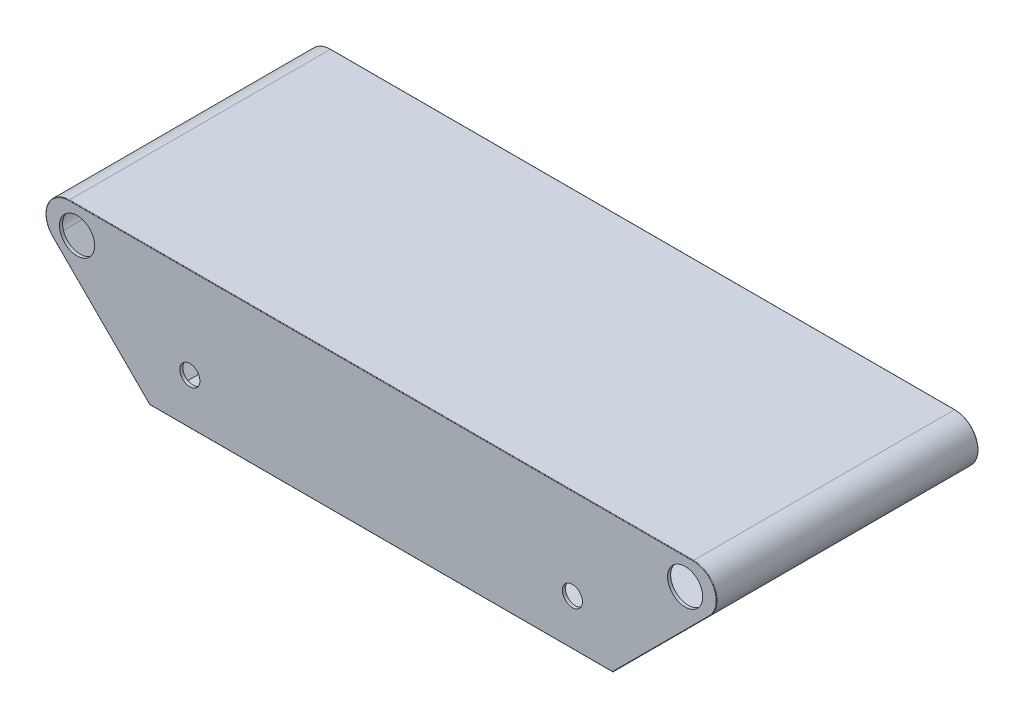
ISO-10303-21;
HEADER;
FILE_DESCRIPTION(('STEP AP214'),'2;1');
FILE_NAME('part.step','',(''),(''),'','','');
FILE_SCHEMA(('AUTOMOTIVE_DESIGN { 1 0 10303 214 1 1 1 1 }'));
ENDSEC;
DATA;
#1=APPLICATION_CONTEXT('core data for automotive mechanical design processes');
#2=APPLICATION_PROTOCOL_DEFINITION('international standard','automotive_design',2000,#1);
#3=PRODUCT_CONTEXT('',#1,'mechanical');
#4=PRODUCT('Part','Part','',(#3));
#5=PRODUCT_RELATED_PRODUCT_CATEGORY('part','',(#4));
#6=PRODUCT_DEFINITION_FORMATION('','',#4);
#7=PRODUCT_DEFINITION_CONTEXT('part definition',#1,'design');
#8=PRODUCT_DEFINITION('design','',#6,#7);
#9=PRODUCT_DEFINITION_SHAPE('','',#8);
#10=(LENGTH_UNIT() NAMED_UNIT(*) SI_UNIT(.MILLI.,.METRE.));
#11=(NAMED_UNIT(*) PLANE_ANGLE_UNIT() SI_UNIT($,.RADIAN.));
#12=(NAMED_UNIT(*) SI_UNIT($,.STERADIAN.) SOLID_ANGLE_UNIT());
#13=UNCERTAINTY_MEASURE_WITH_UNIT(LENGTH_MEASURE(1.E-05),#10,'distance_accuracy_value','');
#14=(GEOMETRIC_REPRESENTATION_CONTEXT(3) GLOBAL_UNCERTAINTY_ASSIGNED_CONTEXT((#13)) GLOBAL_UNIT_ASSIGNED_CONTEXT((#10,
#11,#12)) REPRESENTATION_CONTEXT('',''));
#15=CARTESIAN_POINT('',(0.,0.,0.));
#16=DIRECTION('',(0.,0.,1.));
#17=DIRECTION('',(1.,0.,0.));
#18=AXIS2_PLACEMENT_3D('',#15,#16,#17);
#19=CARTESIAN_POINT('',(-230.,3.04,-130.));
#20=DIRECTION('',(0.,0.,1.));
#21=DIRECTION('',(1.,0.,0.));
#22=AXIS2_PLACEMENT_3D('',#19,#20,#21);
#23=PLANE('',#22);
#24=CARTESIAN_POINT('',(-190.,45.5,-130.));
#25=DIRECTION('',(0.,0.,1.));
#26=DIRECTION('',(1.,0.,0.));
#27=AXIS2_PLACEMENT_3D('',#24,#25,#26);
#28=CIRCLE('',#27,10.);
#29=CARTESIAN_POINT('',(-180.,45.5,-130.));
#30=VERTEX_POINT('',#29);
#31=EDGE_CURVE('E402',#30,#30,#28,.T.);
#32=ORIENTED_EDGE('',*,*,#31,.T.);
#33=EDGE_LOOP('',(#32));
#34=FACE_BOUND('',#33,.T.);
#35=CARTESIAN_POINT('',(190.,45.5,-130.));
#36=DIRECTION('',(0.,0.,1.));
#37=DIRECTION('',(-1.,0.,0.));
#38=AXIS2_PLACEMENT_3D('',#35,#36,#37);
#39=CIRCLE('',#38,10.);
#40=CARTESIAN_POINT('',(180.,45.5,-130.));
#41=VERTEX_POINT('',#40);
#42=EDGE_CURVE('E418',#41,#41,#39,.T.);
#43=ORIENTED_EDGE('',*,*,#42,.T.);
#44=EDGE_LOOP('',(#43));
#45=FACE_BOUND('',#44,.T.);
#46=DIRECTION('',(-1.,0.,0.));
#47=VECTOR('',#46,1.);
#48=CARTESIAN_POINT('',(-230.,0.5,-130.));
#49=LINE('',#48,#47);
#50=CARTESIAN_POINT('',(229.792893218813,0.499999999999996,-130.));
#51=VERTEX_POINT('',#50);
#52=CARTESIAN_POINT('',(-229.792893218813,0.5,-130.));
#53=VERTEX_POINT('',#52);
#54=EDGE_CURVE('E319',#51,#53,#49,.T.);
#55=ORIENTED_EDGE('',*,*,#54,.T.);
#56=DIRECTION('',(0.707106781186544,-0.707106781186551,0.));
#57=VECTOR('',#56,1.);
#58=CARTESIAN_POINT('',(-326.04846686296,96.7555736441475,-130.));
#59=LINE('',#58,#57);
#60=CARTESIAN_POINT('',(-326.04846686296,96.7555736441475,-130.));
#61=VERTEX_POINT('',#60);
#62=EDGE_CURVE('E327',#53,#61,#59,.F.);
#63=ORIENTED_EDGE('',*,*,#62,.T.);
#64=CARTESIAN_POINT('',(-310.,112.804040507107,-130.));
#65=DIRECTION('',(0.,0.,1.));
#66=DIRECTION('',(1.,0.,0.));
#67=AXIS2_PLACEMENT_3D('',#64,#65,#66);
#68=CIRCLE('',#67,22.6959594928929);
#69=CARTESIAN_POINT('',(-310.,135.5,-130.));
#70=VERTEX_POINT('',#69);
#71=EDGE_CURVE('E325',#61,#70,#68,.F.);
#72=ORIENTED_EDGE('',*,*,#71,.T.);
#73=DIRECTION('',(-1.,0.,0.));
#74=VECTOR('',#73,1.);
#75=CARTESIAN_POINT('',(310.,135.5,-130.));
#76=LINE('',#75,#74);
#77=CARTESIAN_POINT('',(310.,135.5,-130.));
#78=VERTEX_POINT('',#77);
#79=EDGE_CURVE('E323',#70,#78,#76,.F.);
#80=ORIENTED_EDGE('',*,*,#79,.T.);
#81=CARTESIAN_POINT('',(310.,112.804040507107,-130.));
#82=DIRECTION('',(0.,0.,1.));
#83=DIRECTION('',(1.,0.,0.));
#84=AXIS2_PLACEMENT_3D('',#81,#82,#83);
#85=CIRCLE('',#84,22.6959594928929);
#86=CARTESIAN_POINT('',(326.04846686296,96.7555736441474,-130.));
#87=VERTEX_POINT('',#86);
#88=EDGE_CURVE('E321',#78,#87,#85,.F.);
#89=ORIENTED_EDGE('',*,*,#88,.T.);
#90=DIRECTION('',(0.707106781186543,0.707106781186552,0.));
#91=VECTOR('',#90,1.);
#92=CARTESIAN_POINT('',(229.646446609407,0.353553390593277,-130.));
#93=LINE('',#92,#91);
#94=EDGE_CURVE('E317',#87,#51,#93,.F.);
#95=ORIENTED_EDGE('',*,*,#94,.T.);
#96=EDGE_LOOP('',(#55,#63,#72,#80,#89,#95));
#97=FACE_BOUND('',#96,.T.);
#98=CARTESIAN_POINT('',(-302.023340597113,109.5,-130.));
#99=DIRECTION('',(0.,0.,1.));
#100=DIRECTION('',(1.,0.,0.));
#101=AXIS2_PLACEMENT_3D('',#98,#99,#100);
#102=CIRCLE('',#101,17.465);
#103=CARTESIAN_POINT('',(-284.558340597113,109.5,-130.));
#104=VERTEX_POINT('',#103);
#105=EDGE_CURVE('E430',#104,#104,#102,.T.);
#106=ORIENTED_EDGE('',*,*,#105,.T.);
#107=EDGE_LOOP('',(#106));
#108=FACE_BOUND('',#107,.T.);
#109=CARTESIAN_POINT('',(302.023340597113,109.5,-130.));
#110=DIRECTION('',(0.,0.,-1.));
#111=DIRECTION('',(-1.,0.,0.));
#112=AXIS2_PLACEMENT_3D('',#109,#110,#111);
#113=CIRCLE('',#112,17.465);
#114=CARTESIAN_POINT('',(284.558340597113,109.5,-130.));
#115=VERTEX_POINT('',#114);
#116=EDGE_CURVE('E427',#115,#115,#113,.T.);
#117=ORIENTED_EDGE('',*,*,#116,.F.);
#118=EDGE_LOOP('',(#117));
#119=FACE_BOUND('',#118,.T.);
#120=ADVANCED_FACE('F75',(#34,#45,#97,#108,#119),#23,.F.);
#121=CARTESIAN_POINT('',(-230.,3.04,130.));
#122=DIRECTION('',(0.,0.,-1.));
#123=DIRECTION('',(-1.,0.,0.));
#124=AXIS2_PLACEMENT_3D('',#121,#122,#123);
#125=PLANE('',#124);
#126=CARTESIAN_POINT('',(-190.,45.5,130.));
#127=DIRECTION('',(0.,0.,1.));
#128=DIRECTION('',(1.,0.,0.));
#129=AXIS2_PLACEMENT_3D('',#126,#127,#128);
#130=CIRCLE('',#129,10.);
#131=CARTESIAN_POINT('',(-180.,45.5,130.));
#132=VERTEX_POINT('',#131);
#133=EDGE_CURVE('E408',#132,#132,#130,.T.);
#134=ORIENTED_EDGE('',*,*,#133,.F.);
#135=EDGE_LOOP('',(#134));
#136=FACE_BOUND('',#135,.T.);
#137=CARTESIAN_POINT('',(190.,45.5,130.));
#138=DIRECTION('',(0.,0.,1.));
#139=DIRECTION('',(-1.,0.,0.));
#140=AXIS2_PLACEMENT_3D('',#137,#138,#139);
#141=CIRCLE('',#140,10.);
#142=CARTESIAN_POINT('',(180.,45.5,130.));
#143=VERTEX_POINT('',#142);
#144=EDGE_CURVE('E413',#143,#143,#141,.T.);
#145=ORIENTED_EDGE('',*,*,#144,.F.);
#146=EDGE_LOOP('',(#145));
#147=FACE_BOUND('',#146,.T.);
#148=CARTESIAN_POINT('',(-310.,112.804040507107,130.));
#149=DIRECTION('',(0.,0.,-1.));
#150=DIRECTION('',(-1.,0.,0.));
#151=AXIS2_PLACEMENT_3D('',#148,#149,#150);
#152=CIRCLE('',#151,22.6959594928929);
#153=CARTESIAN_POINT('',(-310.,135.5,130.));
#154=VERTEX_POINT('',#153);
#155=CARTESIAN_POINT('',(-326.04846686296,96.7555736441475,130.));
#156=VERTEX_POINT('',#155);
#157=EDGE_CURVE('E293',#154,#156,#152,.F.);
#158=ORIENTED_EDGE('',*,*,#157,.T.);
#159=DIRECTION('',(0.707106781186544,-0.707106781186551,0.));
#160=VECTOR('',#159,1.);
#161=CARTESIAN_POINT('',(-229.646446609407,0.353553390593285,130.));
#162=LINE('',#161,#160);
#163=CARTESIAN_POINT('',(-229.792893218813,0.5,130.));
#164=VERTEX_POINT('',#163);
#165=EDGE_CURVE('E295',#156,#164,#162,.T.);
#166=ORIENTED_EDGE('',*,*,#165,.T.);
#167=DIRECTION('',(1.,0.,0.));
#168=VECTOR('',#167,1.);
#169=CARTESIAN_POINT('',(230.,0.5,130.));
#170=LINE('',#169,#168);
#171=CARTESIAN_POINT('',(229.792893218813,0.5,130.));
#172=VERTEX_POINT('',#171);
#173=EDGE_CURVE('E285',#164,#172,#170,.T.);
#174=ORIENTED_EDGE('',*,*,#173,.T.);
#175=DIRECTION('',(0.707106781186543,0.707106781186552,0.));
#176=VECTOR('',#175,1.);
#177=CARTESIAN_POINT('',(326.04846686296,96.7555736441474,130.));
#178=LINE('',#177,#176);
#179=CARTESIAN_POINT('',(326.04846686296,96.7555736441474,130.));
#180=VERTEX_POINT('',#179);
#181=EDGE_CURVE('E287',#172,#180,#178,.T.);
#182=ORIENTED_EDGE('',*,*,#181,.T.);
#183=CARTESIAN_POINT('',(310.,112.804040507107,130.));
#184=DIRECTION('',(0.,0.,-1.));
#185=DIRECTION('',(-1.,0.,0.));
#186=AXIS2_PLACEMENT_3D('',#183,#184,#185);
#187=CIRCLE('',#186,22.6959594928929);
#188=CARTESIAN_POINT('',(310.,135.5,130.));
#189=VERTEX_POINT('',#188);
#190=EDGE_CURVE('E289',#180,#189,#187,.F.);
#191=ORIENTED_EDGE('',*,*,#190,.T.);
#192=DIRECTION('',(-1.,0.,0.));
#193=VECTOR('',#192,1.);
#194=CARTESIAN_POINT('',(-310.,135.5,130.));
#195=LINE('',#194,#193);
#196=EDGE_CURVE('E291',#189,#154,#195,.T.);
#197=ORIENTED_EDGE('',*,*,#196,.T.);
#198=EDGE_LOOP('',(#158,#166,#174,#182,#191,#197));
#199=FACE_BOUND('',#198,.T.);
#200=CARTESIAN_POINT('',(-302.023340597113,109.5,130.));
#201=DIRECTION('',(0.,0.,1.));
#202=DIRECTION('',(1.,0.,0.));
#203=AXIS2_PLACEMENT_3D('',#200,#201,#202);
#204=CIRCLE('',#203,17.465);
#205=CARTESIAN_POINT('',(-284.558340597113,109.5,130.));
#206=VERTEX_POINT('',#205);
#207=EDGE_CURVE('E424',#206,#206,#204,.T.);
#208=ORIENTED_EDGE('',*,*,#207,.F.);
#209=EDGE_LOOP('',(#208));
#210=FACE_BOUND('',#209,.T.);
#211=CARTESIAN_POINT('',(302.023340597113,109.5,130.));
#212=DIRECTION('',(0.,0.,-1.));
#213=DIRECTION('',(-1.,0.,0.));
#214=AXIS2_PLACEMENT_3D('',#211,#212,#213);
#215=CIRCLE('',#214,17.465);
#216=CARTESIAN_POINT('',(284.558340597113,109.5,130.));
#217=VERTEX_POINT('',#216);
#218=EDGE_CURVE('E396',#217,#217,#215,.T.);
#219=ORIENTED_EDGE('',*,*,#218,.T.);
#220=EDGE_LOOP('',(#219));
#221=FACE_BOUND('',#220,.T.);
#222=ADVANCED_FACE('F475',(#136,#147,#199,#210,#221),#125,.F.);
#223=CARTESIAN_POINT('',(0.,0.,0.));
#224=DIRECTION('',(0.,-1.,0.));
#225=DIRECTION('',(0.,0.,-1.));
#226=AXIS2_PLACEMENT_3D('',#223,#224,#225);
#227=PLANE('',#226);
#228=DIRECTION('',(0.,0.,-1.));
#229=VECTOR('',#228,1.);
#230=CARTESIAN_POINT('',(229.792893218813,0.,0.));
#231=LINE('',#230,#229);
#232=CARTESIAN_POINT('',(229.792893218813,0.,-129.5));
#233=VERTEX_POINT('',#232);
#234=CARTESIAN_POINT('',(229.792893218813,0.,129.5));
#235=VERTEX_POINT('',#234);
#236=EDGE_CURVE('E336',#233,#235,#231,.F.);
#237=ORIENTED_EDGE('',*,*,#236,.T.);
#238=DIRECTION('',(1.,0.,0.));
#239=VECTOR('',#238,1.);
#240=CARTESIAN_POINT('',(-230.,0.,129.5));
#241=LINE('',#240,#239);
#242=CARTESIAN_POINT('',(-229.792893218813,0.,129.5));
#243=VERTEX_POINT('',#242);
#244=EDGE_CURVE('E12',#235,#243,#241,.F.);
#245=ORIENTED_EDGE('',*,*,#244,.T.);
#246=DIRECTION('',(0.,0.,1.));
#247=VECTOR('',#246,1.);
#248=CARTESIAN_POINT('',(-229.792893218813,0.,0.));
#249=LINE('',#248,#247);
#250=CARTESIAN_POINT('',(-229.792893218813,0.,-129.5));
#251=VERTEX_POINT('',#250);
#252=EDGE_CURVE('E84',#243,#251,#249,.F.);
#253=ORIENTED_EDGE('',*,*,#252,.T.);
#254=DIRECTION('',(-1.,0.,0.));
#255=VECTOR('',#254,1.);
#256=CARTESIAN_POINT('',(230.,0.,-129.5));
#257=LINE('',#256,#255);
#258=EDGE_CURVE('E338',#251,#233,#257,.F.);
#259=ORIENTED_EDGE('',*,*,#258,.T.);
#260=EDGE_LOOP('',(#237,#245,#253,#259));
#261=FACE_BOUND('',#260,.T.);
#262=ADVANCED_FACE('F480',(#261),#227,.T.);
#263=CARTESIAN_POINT('',(-326.402020253553,96.4020202535542,126.96));
#264=DIRECTION('',(-0.707106781186551,-0.707106781186544,0.));
#265=DIRECTION('',(0.707106781186544,-0.707106781186551,0.));
#266=AXIS2_PLACEMENT_3D('',#263,#264,#265);
#267=PLANE('',#266);
#268=DIRECTION('',(0.,0.,1.));
#269=VECTOR('',#268,1.);
#270=CARTESIAN_POINT('',(-230.146446609407,0.146446609406728,126.96));
#271=LINE('',#270,#269);
#272=CARTESIAN_POINT('',(-230.146446609407,0.146446609406724,-129.5));
#273=VERTEX_POINT('',#272);
#274=CARTESIAN_POINT('',(-230.146446609407,0.146446609406724,129.5));
#275=VERTEX_POINT('',#274);
#276=EDGE_CURVE('E298',#273,#275,#271,.T.);
#277=ORIENTED_EDGE('',*,*,#276,.T.);
#278=DIRECTION('',(0.707106781186544,-0.707106781186551,0.));
#279=VECTOR('',#278,1.);
#280=CARTESIAN_POINT('',(-326.402020253553,96.4020202535542,129.5));
#281=LINE('',#280,#279);
#282=CARTESIAN_POINT('',(-326.402020253553,96.4020202535542,129.5));
#283=VERTEX_POINT('',#282);
#284=EDGE_CURVE('E302',#275,#283,#281,.F.);
#285=ORIENTED_EDGE('',*,*,#284,.T.);
#286=DIRECTION('',(0.,0.,1.));
#287=VECTOR('',#286,1.);
#288=CARTESIAN_POINT('',(-326.402020253553,96.4020202535542,126.96));
#289=LINE('',#288,#287);
#290=CARTESIAN_POINT('',(-326.402020253553,96.4020202535542,-129.5));
#291=VERTEX_POINT('',#290);
#292=EDGE_CURVE('E267',#291,#283,#289,.T.);
#293=ORIENTED_EDGE('',*,*,#292,.F.);
#294=DIRECTION('',(0.707106781186544,-0.707106781186551,0.));
#295=VECTOR('',#294,1.);
#296=CARTESIAN_POINT('',(-230.,0.,-129.5));
#297=LINE('',#296,#295);
#298=EDGE_CURVE('E300',#291,#273,#297,.T.);
#299=ORIENTED_EDGE('',*,*,#298,.T.);
#300=EDGE_LOOP('',(#277,#285,#293,#299));
#301=FACE_BOUND('',#300,.T.);
#302=ADVANCED_FACE('F612',(#301),#267,.T.);
#303=CARTESIAN_POINT('',(-310.,112.804040507107,126.96));
#304=DIRECTION('',(0.,0.,1.));
#305=DIRECTION('',(1.,0.,0.));
#306=AXIS2_PLACEMENT_3D('',#303,#304,#305);
#307=CYLINDRICAL_SURFACE('',#306,23.1959594928929);
#308=ORIENTED_EDGE('',*,*,#292,.T.);
#309=CARTESIAN_POINT('',(-310.,112.804040507107,129.5));
#310=DIRECTION('',(0.,0.,-1.));
#311=DIRECTION('',(-1.,0.,0.));
#312=AXIS2_PLACEMENT_3D('',#309,#310,#311);
#313=CIRCLE('',#312,23.1959594928929);
#314=CARTESIAN_POINT('',(-310.,136.,129.5));
#315=VERTEX_POINT('',#314);
#316=EDGE_CURVE('E307',#283,#315,#313,.T.);
#317=ORIENTED_EDGE('',*,*,#316,.T.);
#318=DIRECTION('',(0.,0.,1.));
#319=VECTOR('',#318,1.);
#320=CARTESIAN_POINT('',(-310.,136.,126.96));
#321=LINE('',#320,#319);
#322=CARTESIAN_POINT('',(-310.,136.,-129.5));
#323=VERTEX_POINT('',#322);
#324=EDGE_CURVE('E270',#323,#315,#321,.T.);
#325=ORIENTED_EDGE('',*,*,#324,.F.);
#326=CARTESIAN_POINT('',(-310.,112.804040507107,-129.5));
#327=DIRECTION('',(0.,0.,1.));
#328=DIRECTION('',(1.,0.,0.));
#329=AXIS2_PLACEMENT_3D('',#326,#327,#328);
#330=CIRCLE('',#329,23.1959594928929);
#331=EDGE_CURVE('E305',#323,#291,#330,.T.);
#332=ORIENTED_EDGE('',*,*,#331,.T.);
#333=EDGE_LOOP('',(#308,#317,#325,#332));
#334=FACE_BOUND('',#333,.T.);
#335=ADVANCED_FACE('F610',(#334),#307,.T.);
#336=CARTESIAN_POINT('',(310.,136.,126.96));
#337=DIRECTION('',(0.,1.,0.));
#338=DIRECTION('',(-1.,0.,0.));
#339=AXIS2_PLACEMENT_3D('',#336,#337,#338);
#340=PLANE('',#339);
#341=ORIENTED_EDGE('',*,*,#324,.T.);
#342=DIRECTION('',(-1.,0.,0.));
#343=VECTOR('',#342,1.);
#344=CARTESIAN_POINT('',(310.,136.,129.5));
#345=LINE('',#344,#343);
#346=CARTESIAN_POINT('',(310.,136.,129.5));
#347=VERTEX_POINT('',#346);
#348=EDGE_CURVE('E311',#315,#347,#345,.F.);
#349=ORIENTED_EDGE('',*,*,#348,.T.);
#350=DIRECTION('',(0.,0.,1.));
#351=VECTOR('',#350,1.);
#352=CARTESIAN_POINT('',(310.,136.,126.96));
#353=LINE('',#352,#351);
#354=CARTESIAN_POINT('',(310.,136.,-129.5));
#355=VERTEX_POINT('',#354);
#356=EDGE_CURVE('E273',#355,#347,#353,.T.);
#357=ORIENTED_EDGE('',*,*,#356,.F.);
#358=DIRECTION('',(-1.,0.,0.));
#359=VECTOR('',#358,1.);
#360=CARTESIAN_POINT('',(-310.,136.,-129.5));
#361=LINE('',#360,#359);
#362=EDGE_CURVE('E309',#355,#323,#361,.T.);
#363=ORIENTED_EDGE('',*,*,#362,.T.);
#364=EDGE_LOOP('',(#341,#349,#357,#363));
#365=FACE_BOUND('',#364,.T.);
#366=ADVANCED_FACE('F570',(#365),#340,.T.);
#367=CARTESIAN_POINT('',(310.,112.804040507107,126.96));
#368=DIRECTION('',(0.,0.,1.));
#369=DIRECTION('',(1.,0.,0.));
#370=AXIS2_PLACEMENT_3D('',#367,#368,#369);
#371=CYLINDRICAL_SURFACE('',#370,23.1959594928929);
#372=ORIENTED_EDGE('',*,*,#356,.T.);
#373=CARTESIAN_POINT('',(310.,112.804040507107,129.5));
#374=DIRECTION('',(0.,0.,-1.));
#375=DIRECTION('',(-1.,0.,0.));
#376=AXIS2_PLACEMENT_3D('',#373,#374,#375);
#377=CIRCLE('',#376,23.1959594928929);
#378=CARTESIAN_POINT('',(326.402020253553,96.4020202535542,129.5));
#379=VERTEX_POINT('',#378);
#380=EDGE_CURVE('E315',#347,#379,#377,.T.);
#381=ORIENTED_EDGE('',*,*,#380,.T.);
#382=DIRECTION('',(0.,0.,1.));
#383=VECTOR('',#382,1.);
#384=CARTESIAN_POINT('',(326.402020253553,96.4020202535542,126.96));
#385=LINE('',#384,#383);
#386=CARTESIAN_POINT('',(326.402020253553,96.4020202535542,-129.5));
#387=VERTEX_POINT('',#386);
#388=EDGE_CURVE('E266',#387,#379,#385,.T.);
#389=ORIENTED_EDGE('',*,*,#388,.F.);
#390=CARTESIAN_POINT('',(310.,112.804040507107,-129.5));
#391=DIRECTION('',(0.,0.,1.));
#392=DIRECTION('',(1.,0.,0.));
#393=AXIS2_PLACEMENT_3D('',#390,#391,#392);
#394=CIRCLE('',#393,23.1959594928929);
#395=EDGE_CURVE('E313',#387,#355,#394,.T.);
#396=ORIENTED_EDGE('',*,*,#395,.T.);
#397=EDGE_LOOP('',(#372,#381,#389,#396));
#398=FACE_BOUND('',#397,.T.);
#399=ADVANCED_FACE('F567',(#398),#371,.T.);
#400=CARTESIAN_POINT('',(230.,0.,126.96));
#401=DIRECTION('',(0.707106781186552,-0.707106781186543,0.));
#402=DIRECTION('',(0.707106781186543,0.707106781186552,0.));
#403=AXIS2_PLACEMENT_3D('',#400,#401,#402);
#404=PLANE('',#403);
#405=ORIENTED_EDGE('',*,*,#388,.T.);
#406=DIRECTION('',(0.707106781186543,0.707106781186552,0.));
#407=VECTOR('',#406,1.);
#408=CARTESIAN_POINT('',(230.,0.,129.5));
#409=LINE('',#408,#407);
#410=CARTESIAN_POINT('',(230.146446609407,0.146446609406716,129.5));
#411=VERTEX_POINT('',#410);
#412=EDGE_CURVE('E334',#379,#411,#409,.F.);
#413=ORIENTED_EDGE('',*,*,#412,.T.);
#414=DIRECTION('',(0.,0.,-1.));
#415=VECTOR('',#414,1.);
#416=CARTESIAN_POINT('',(230.146446609407,0.146446609406716,126.96));
#417=LINE('',#416,#415);
#418=CARTESIAN_POINT('',(230.146446609407,0.146446609406716,-129.5));
#419=VERTEX_POINT('',#418);
#420=EDGE_CURVE('E330',#411,#419,#417,.T.);
#421=ORIENTED_EDGE('',*,*,#420,.T.);
#422=DIRECTION('',(0.707106781186543,0.707106781186552,0.));
#423=VECTOR('',#422,1.);
#424=CARTESIAN_POINT('',(326.402020253553,96.4020202535542,-129.5));
#425=LINE('',#424,#423);
#426=EDGE_CURVE('E332',#419,#387,#425,.T.);
#427=ORIENTED_EDGE('',*,*,#426,.T.);
#428=EDGE_LOOP('',(#405,#413,#421,#427));
#429=FACE_BOUND('',#428,.T.);
#430=ADVANCED_FACE('F554',(#429),#404,.T.);
#431=CARTESIAN_POINT('',(310.,112.804040507107,-129.5));
#432=DIRECTION('',(0.,0.,1.));
#433=DIRECTION('',(1.,0.,0.));
#434=AXIS2_PLACEMENT_3D('',#431,#432,#433);
#435=TOROIDAL_SURFACE('',#434,22.6959594928929,0.5);
#436=CARTESIAN_POINT('',(310.,135.5,-129.5));
#437=DIRECTION('',(-1.,0.,0.));
#438=DIRECTION('',(0.,0.,1.));
#439=AXIS2_PLACEMENT_3D('',#436,#437,#438);
#440=CIRCLE('',#439,0.5);
#441=EDGE_CURVE('E247',#355,#78,#440,.T.);
#442=ORIENTED_EDGE('',*,*,#441,.F.);
#443=ORIENTED_EDGE('',*,*,#395,.F.);
#444=CARTESIAN_POINT('',(326.04846686296,96.7555736441474,-129.5));
#445=DIRECTION('',(-0.70710678118652,-0.707106781186575,0.));
#446=DIRECTION('',(0.707106781186575,-0.70710678118652,0.));
#447=AXIS2_PLACEMENT_3D('',#444,#445,#446);
#448=CIRCLE('',#447,0.5);
#449=EDGE_CURVE('E242',#87,#387,#448,.T.);
#450=ORIENTED_EDGE('',*,*,#449,.F.);
#451=ORIENTED_EDGE('',*,*,#88,.F.);
#452=EDGE_LOOP('',(#442,#443,#450,#451));
#453=FACE_BOUND('',#452,.T.);
#454=ADVANCED_FACE('F77',(#453),#435,.T.);
#455=CARTESIAN_POINT('',(229.646446609407,0.353553390593272,-129.5));
#456=DIRECTION('',(-0.707106781186543,-0.707106781186552,0.));
#457=DIRECTION('',(0.707106781186552,-0.707106781186543,0.));
#458=AXIS2_PLACEMENT_3D('',#455,#456,#457);
#459=CYLINDRICAL_SURFACE('',#458,0.5);
#460=ORIENTED_EDGE('',*,*,#449,.T.);
#461=ORIENTED_EDGE('',*,*,#426,.F.);
#462=CARTESIAN_POINT('',(229.792893218813,0.499999999999996,-129.5));
#463=DIRECTION('',(-0.707106781186542,-0.707106781186553,0.));
#464=DIRECTION('',(0.707106781186553,-0.707106781186542,0.));
#465=AXIS2_PLACEMENT_3D('',#462,#463,#464);
#466=CIRCLE('',#465,0.5);
#467=EDGE_CURVE('E387',#51,#419,#466,.T.);
#468=ORIENTED_EDGE('',*,*,#467,.F.);
#469=ORIENTED_EDGE('',*,*,#94,.F.);
#470=EDGE_LOOP('',(#460,#461,#468,#469));
#471=FACE_BOUND('',#470,.T.);
#472=ADVANCED_FACE('F547',(#471),#459,.T.);
#473=CARTESIAN_POINT('',(310.,135.5,-129.5));
#474=DIRECTION('',(1.,0.,0.));
#475=DIRECTION('',(0.,1.,0.));
#476=AXIS2_PLACEMENT_3D('',#473,#474,#475);
#477=CYLINDRICAL_SURFACE('',#476,0.5);
#478=ORIENTED_EDGE('',*,*,#441,.T.);
#479=ORIENTED_EDGE('',*,*,#79,.F.);
#480=CARTESIAN_POINT('',(-310.,135.5,-129.5));
#481=DIRECTION('',(-1.,0.,0.));
#482=DIRECTION('',(0.,0.,1.));
#483=AXIS2_PLACEMENT_3D('',#480,#481,#482);
#484=CIRCLE('',#483,0.5);
#485=EDGE_CURVE('E384',#323,#70,#484,.T.);
#486=ORIENTED_EDGE('',*,*,#485,.F.);
#487=ORIENTED_EDGE('',*,*,#362,.F.);
#488=EDGE_LOOP('',(#478,#479,#486,#487));
#489=FACE_BOUND('',#488,.T.);
#490=ADVANCED_FACE('F544',(#489),#477,.T.);
#491=CARTESIAN_POINT('',(229.792893218813,0.499999999999995,-129.5));
#492=DIRECTION('',(0.,0.,-1.));
#493=DIRECTION('',(0.,1.,0.));
#494=AXIS2_PLACEMENT_3D('',#491,#492,#493);
#495=SPHERICAL_SURFACE('',#494,0.5);
#496=CARTESIAN_POINT('',(229.792893218813,0.5,-129.5));
#497=DIRECTION('',(1.,0.,0.));
#498=DIRECTION('',(0.,0.,-1.));
#499=AXIS2_PLACEMENT_3D('',#496,#497,#498);
#500=CIRCLE('',#499,0.5);
#501=EDGE_CURVE('E378',#51,#233,#500,.F.);
#502=ORIENTED_EDGE('',*,*,#501,.F.);
#503=ORIENTED_EDGE('',*,*,#467,.T.);
#504=CARTESIAN_POINT('',(229.792893218813,0.499999999999988,-129.5));
#505=DIRECTION('',(0.,0.,-1.));
#506=DIRECTION('',(-1.,0.,0.));
#507=AXIS2_PLACEMENT_3D('',#504,#505,#506);
#508=CIRCLE('',#507,0.5);
#509=EDGE_CURVE('E381',#233,#419,#508,.F.);
#510=ORIENTED_EDGE('',*,*,#509,.F.);
#511=EDGE_LOOP('',(#502,#503,#510));
#512=FACE_BOUND('',#511,.T.);
#513=ADVANCED_FACE('F540',(#512),#495,.T.);
#514=CARTESIAN_POINT('',(-310.,112.804040507107,-129.5));
#515=DIRECTION('',(0.,0.,1.));
#516=DIRECTION('',(1.,0.,0.));
#517=AXIS2_PLACEMENT_3D('',#514,#515,#516);
#518=TOROIDAL_SURFACE('',#517,22.6959594928929,0.5);
#519=ORIENTED_EDGE('',*,*,#485,.T.);
#520=ORIENTED_EDGE('',*,*,#71,.F.);
#521=CARTESIAN_POINT('',(-326.04846686296,96.7555736441475,-129.5));
#522=DIRECTION('',(0.707106781186534,-0.707106781186561,0.));
#523=DIRECTION('',(0.707106781186561,0.707106781186534,0.));
#524=AXIS2_PLACEMENT_3D('',#521,#522,#523);
#525=CIRCLE('',#524,0.5);
#526=EDGE_CURVE('E376',#291,#61,#525,.T.);
#527=ORIENTED_EDGE('',*,*,#526,.F.);
#528=ORIENTED_EDGE('',*,*,#331,.F.);
#529=EDGE_LOOP('',(#519,#520,#527,#528));
#530=FACE_BOUND('',#529,.T.);
#531=ADVANCED_FACE('F536',(#530),#518,.T.);
#532=CARTESIAN_POINT('',(1.16644660940934,-228.126446609407,129.5));
#533=DIRECTION('',(-0.707106781186543,-0.707106781186552,0.));
#534=DIRECTION('',(0.707106781186552,-0.707106781186543,0.));
#535=AXIS2_PLACEMENT_3D('',#532,#533,#534);
#536=CYLINDRICAL_SURFACE('',#535,0.5);
#537=CARTESIAN_POINT('',(229.792893218813,0.499999999999988,129.5));
#538=DIRECTION('',(-0.707106781186533,-0.707106781186562,0.));
#539=DIRECTION('',(0.707106781186562,-0.707106781186533,0.));
#540=AXIS2_PLACEMENT_3D('',#537,#538,#539);
#541=CIRCLE('',#540,0.5);
#542=EDGE_CURVE('E370',#411,#172,#541,.T.);
#543=ORIENTED_EDGE('',*,*,#542,.F.);
#544=ORIENTED_EDGE('',*,*,#412,.F.);
#545=CARTESIAN_POINT('',(326.04846686296,96.7555736441474,129.5));
#546=DIRECTION('',(0.707106781186548,0.707106781186548,0.));
#547=DIRECTION('',(-0.707106781186548,0.707106781186548,0.));
#548=AXIS2_PLACEMENT_3D('',#545,#546,#547);
#549=CIRCLE('',#548,0.5);
#550=EDGE_CURVE('E373',#180,#379,#549,.T.);
#551=ORIENTED_EDGE('',*,*,#550,.F.);
#552=ORIENTED_EDGE('',*,*,#181,.F.);
#553=EDGE_LOOP('',(#543,#544,#551,#552));
#554=FACE_BOUND('',#553,.T.);
#555=ADVANCED_FACE('F532',(#554),#536,.T.);
#556=CARTESIAN_POINT('',(229.792893218813,0.5,126.96));
#557=DIRECTION('',(0.,0.,-1.));
#558=DIRECTION('',(-1.,0.,0.));
#559=AXIS2_PLACEMENT_3D('',#556,#557,#558);
#560=CYLINDRICAL_SURFACE('',#559,0.5);
#561=ORIENTED_EDGE('',*,*,#509,.T.);
#562=ORIENTED_EDGE('',*,*,#420,.F.);
#563=CARTESIAN_POINT('',(229.792893218813,0.5,129.5));
#564=DIRECTION('',(0.,0.,1.));
#565=DIRECTION('',(1.,0.,0.));
#566=AXIS2_PLACEMENT_3D('',#563,#564,#565);
#567=CIRCLE('',#566,0.5);
#568=EDGE_CURVE('E367',#235,#411,#567,.T.);
#569=ORIENTED_EDGE('',*,*,#568,.F.);
#570=ORIENTED_EDGE('',*,*,#236,.F.);
#571=EDGE_LOOP('',(#561,#562,#569,#570));
#572=FACE_BOUND('',#571,.T.);
#573=ADVANCED_FACE('F528',(#572),#560,.T.);
#574=CARTESIAN_POINT('',(-230.,0.5,-129.5));
#575=DIRECTION('',(1.,0.,0.));
#576=DIRECTION('',(0.,0.,-1.));
#577=AXIS2_PLACEMENT_3D('',#574,#575,#576);
#578=CYLINDRICAL_SURFACE('',#577,0.5);
#579=ORIENTED_EDGE('',*,*,#501,.T.);
#580=ORIENTED_EDGE('',*,*,#258,.F.);
#581=CARTESIAN_POINT('',(-229.792893218813,0.5,-129.5));
#582=DIRECTION('',(-1.,0.,0.));
#583=DIRECTION('',(0.,0.,1.));
#584=AXIS2_PLACEMENT_3D('',#581,#582,#583);
#585=CIRCLE('',#584,0.5);
#586=EDGE_CURVE('E364',#53,#251,#585,.T.);
#587=ORIENTED_EDGE('',*,*,#586,.F.);
#588=ORIENTED_EDGE('',*,*,#54,.F.);
#589=EDGE_LOOP('',(#579,#580,#587,#588));
#590=FACE_BOUND('',#589,.T.);
#591=ADVANCED_FACE('F524',(#590),#578,.T.);
#592=CARTESIAN_POINT('',(-326.04846686296,96.7555736441474,-129.5));
#593=DIRECTION('',(-0.707106781186544,0.707106781186551,0.));
#594=DIRECTION('',(-0.707106781186551,-0.707106781186544,0.));
#595=AXIS2_PLACEMENT_3D('',#592,#593,#594);
#596=CYLINDRICAL_SURFACE('',#595,0.5);
#597=ORIENTED_EDGE('',*,*,#526,.T.);
#598=ORIENTED_EDGE('',*,*,#62,.F.);
#599=CARTESIAN_POINT('',(-229.792893218813,0.500000000000001,-129.5));
#600=DIRECTION('',(0.707106781186533,-0.707106781186562,0.));
#601=DIRECTION('',(0.707106781186562,0.707106781186533,0.));
#602=AXIS2_PLACEMENT_3D('',#599,#600,#601);
#603=CIRCLE('',#602,0.5);
#604=EDGE_CURVE('E361',#273,#53,#603,.T.);
#605=ORIENTED_EDGE('',*,*,#604,.F.);
#606=ORIENTED_EDGE('',*,*,#298,.F.);
#607=EDGE_LOOP('',(#597,#598,#605,#606));
#608=FACE_BOUND('',#607,.T.);
#609=ADVANCED_FACE('F520',(#608),#596,.T.);
#610=CARTESIAN_POINT('',(310.,112.804040507107,129.5));
#611=DIRECTION('',(0.,0.,-1.));
#612=DIRECTION('',(-1.,0.,0.));
#613=AXIS2_PLACEMENT_3D('',#610,#611,#612);
#614=TOROIDAL_SURFACE('',#613,22.6959594928929,0.5);
#615=ORIENTED_EDGE('',*,*,#550,.T.);
#616=ORIENTED_EDGE('',*,*,#380,.F.);
#617=CARTESIAN_POINT('',(310.,135.5,129.5));
#618=DIRECTION('',(-1.,0.,0.));
#619=DIRECTION('',(0.,0.,1.));
#620=AXIS2_PLACEMENT_3D('',#617,#618,#619);
#621=CIRCLE('',#620,0.5);
#622=EDGE_CURVE('E358',#189,#347,#621,.T.);
#623=ORIENTED_EDGE('',*,*,#622,.F.);
#624=ORIENTED_EDGE('',*,*,#190,.F.);
#625=EDGE_LOOP('',(#615,#616,#623,#624));
#626=FACE_BOUND('',#625,.T.);
#627=ADVANCED_FACE('F516',(#626),#614,.T.);
#628=CARTESIAN_POINT('',(229.792893218813,0.5,129.5));
#629=DIRECTION('',(0.,0.,1.));
#630=DIRECTION('',(1.,0.,0.));
#631=AXIS2_PLACEMENT_3D('',#628,#629,#630);
#632=SPHERICAL_SURFACE('',#631,0.5);
#633=ORIENTED_EDGE('',*,*,#568,.T.);
#634=ORIENTED_EDGE('',*,*,#542,.T.);
#635=CARTESIAN_POINT('',(229.792893218813,0.5,129.5));
#636=DIRECTION('',(1.,0.,0.));
#637=DIRECTION('',(0.,1.,0.));
#638=AXIS2_PLACEMENT_3D('',#635,#636,#637);
#639=CIRCLE('',#638,0.5);
#640=EDGE_CURVE('E355',#235,#172,#639,.F.);
#641=ORIENTED_EDGE('',*,*,#640,.F.);
#642=EDGE_LOOP('',(#633,#634,#641));
#643=FACE_BOUND('',#642,.T.);
#644=ADVANCED_FACE('F512',(#643),#632,.T.);
#645=CARTESIAN_POINT('',(-229.792893218813,0.5,-129.5));
#646=DIRECTION('',(0.,0.,-1.));
#647=DIRECTION('',(-1.,0.,0.));
#648=AXIS2_PLACEMENT_3D('',#645,#646,#647);
#649=SPHERICAL_SURFACE('',#648,0.5);
#650=ORIENTED_EDGE('',*,*,#604,.T.);
#651=ORIENTED_EDGE('',*,*,#586,.T.);
#652=CARTESIAN_POINT('',(-229.792893218813,0.5,-129.5));
#653=DIRECTION('',(0.,0.,-1.));
#654=DIRECTION('',(-1.,0.,0.));
#655=AXIS2_PLACEMENT_3D('',#652,#653,#654);
#656=CIRCLE('',#655,0.5);
#657=EDGE_CURVE('E352',#273,#251,#656,.F.);
#658=ORIENTED_EDGE('',*,*,#657,.F.);
#659=EDGE_LOOP('',(#650,#651,#658));
#660=FACE_BOUND('',#659,.T.);
#661=ADVANCED_FACE('F508',(#660),#649,.T.);
#662=CARTESIAN_POINT('',(-230.,135.5,129.5));
#663=DIRECTION('',(1.,0.,0.));
#664=DIRECTION('',(0.,1.,0.));
#665=AXIS2_PLACEMENT_3D('',#662,#663,#664);
#666=CYLINDRICAL_SURFACE('',#665,0.5);
#667=ORIENTED_EDGE('',*,*,#622,.T.);
#668=ORIENTED_EDGE('',*,*,#348,.F.);
#669=CARTESIAN_POINT('',(-310.,135.5,129.5));
#670=DIRECTION('',(-1.,0.,0.));
#671=DIRECTION('',(0.,0.,1.));
#672=AXIS2_PLACEMENT_3D('',#669,#670,#671);
#673=CIRCLE('',#672,0.5);
#674=EDGE_CURVE('E349',#154,#315,#673,.T.);
#675=ORIENTED_EDGE('',*,*,#674,.F.);
#676=ORIENTED_EDGE('',*,*,#196,.F.);
#677=EDGE_LOOP('',(#667,#668,#675,#676));
#678=FACE_BOUND('',#677,.T.);
#679=ADVANCED_FACE('F504',(#678),#666,.T.);
#680=CARTESIAN_POINT('',(-230.,0.5,129.5));
#681=DIRECTION('',(-1.,0.,0.));
#682=DIRECTION('',(0.,0.,1.));
#683=AXIS2_PLACEMENT_3D('',#680,#681,#682);
#684=CYLINDRICAL_SURFACE('',#683,0.5);
#685=ORIENTED_EDGE('',*,*,#640,.T.);
#686=ORIENTED_EDGE('',*,*,#173,.F.);
#687=CARTESIAN_POINT('',(-229.792893218813,0.5,129.5));
#688=DIRECTION('',(-1.,0.,0.));
#689=DIRECTION('',(0.,0.,1.));
#690=AXIS2_PLACEMENT_3D('',#687,#688,#689);
#691=CIRCLE('',#690,0.5);
#692=EDGE_CURVE('E347',#243,#164,#691,.T.);
#693=ORIENTED_EDGE('',*,*,#692,.F.);
#694=ORIENTED_EDGE('',*,*,#244,.F.);
#695=EDGE_LOOP('',(#685,#686,#693,#694));
#696=FACE_BOUND('',#695,.T.);
#697=ADVANCED_FACE('F500',(#696),#684,.T.);
#698=CARTESIAN_POINT('',(-229.792893218813,0.5,126.96));
#699=DIRECTION('',(0.,0.,1.));
#700=DIRECTION('',(1.,0.,0.));
#701=AXIS2_PLACEMENT_3D('',#698,#699,#700);
#702=CYLINDRICAL_SURFACE('',#701,0.5);
#703=ORIENTED_EDGE('',*,*,#657,.T.);
#704=ORIENTED_EDGE('',*,*,#252,.F.);
#705=CARTESIAN_POINT('',(-229.792893218813,0.499999999999996,129.5));
#706=DIRECTION('',(0.,0.,1.));
#707=DIRECTION('',(1.,0.,0.));
#708=AXIS2_PLACEMENT_3D('',#705,#706,#707);
#709=CIRCLE('',#708,0.5);
#710=EDGE_CURVE('E92',#275,#243,#709,.T.);
#711=ORIENTED_EDGE('',*,*,#710,.F.);
#712=ORIENTED_EDGE('',*,*,#276,.F.);
#713=EDGE_LOOP('',(#703,#704,#711,#712));
#714=FACE_BOUND('',#713,.T.);
#715=ADVANCED_FACE('F496',(#714),#702,.T.);
#716=CARTESIAN_POINT('',(-310.,112.804040507107,129.5));
#717=DIRECTION('',(0.,0.,-1.));
#718=DIRECTION('',(-1.,0.,0.));
#719=AXIS2_PLACEMENT_3D('',#716,#717,#718);
#720=TOROIDAL_SURFACE('',#719,22.6959594928929,0.5);
#721=ORIENTED_EDGE('',*,*,#674,.T.);
#722=ORIENTED_EDGE('',*,*,#316,.F.);
#723=CARTESIAN_POINT('',(-326.04846686296,96.7555736441475,129.5));
#724=DIRECTION('',(0.707106781186534,-0.707106781186561,0.));
#725=DIRECTION('',(0.707106781186561,0.707106781186534,0.));
#726=AXIS2_PLACEMENT_3D('',#723,#724,#725);
#727=CIRCLE('',#726,0.5);
#728=EDGE_CURVE('E343',#156,#283,#727,.T.);
#729=ORIENTED_EDGE('',*,*,#728,.F.);
#730=ORIENTED_EDGE('',*,*,#157,.F.);
#731=EDGE_LOOP('',(#721,#722,#729,#730));
#732=FACE_BOUND('',#731,.T.);
#733=ADVANCED_FACE('F493',(#732),#720,.T.);
#734=CARTESIAN_POINT('',(-229.792893218813,0.5,129.5));
#735=DIRECTION('',(0.,0.,1.));
#736=DIRECTION('',(0.,-1.,0.));
#737=AXIS2_PLACEMENT_3D('',#734,#735,#736);
#738=SPHERICAL_SURFACE('',#737,0.5);
#739=ORIENTED_EDGE('',*,*,#710,.T.);
#740=ORIENTED_EDGE('',*,*,#692,.T.);
#741=CARTESIAN_POINT('',(-229.792893218813,0.5,129.5));
#742=DIRECTION('',(0.707106781186532,-0.707106781186563,0.));
#743=DIRECTION('',(0.707106781186563,0.707106781186532,0.));
#744=AXIS2_PLACEMENT_3D('',#741,#742,#743);
#745=CIRCLE('',#744,0.5);
#746=EDGE_CURVE('E341',#275,#164,#745,.F.);
#747=ORIENTED_EDGE('',*,*,#746,.F.);
#748=EDGE_LOOP('',(#739,#740,#747));
#749=FACE_BOUND('',#748,.T.);
#750=ADVANCED_FACE('F489',(#749),#738,.T.);
#751=CARTESIAN_POINT('',(-231.166446609407,1.8735533905933,129.5));
#752=DIRECTION('',(-0.707106781186544,0.707106781186551,0.));
#753=DIRECTION('',(-0.707106781186551,-0.707106781186544,0.));
#754=AXIS2_PLACEMENT_3D('',#751,#752,#753);
#755=CYLINDRICAL_SURFACE('',#754,0.5);
#756=ORIENTED_EDGE('',*,*,#728,.T.);
#757=ORIENTED_EDGE('',*,*,#284,.F.);
#758=ORIENTED_EDGE('',*,*,#746,.T.);
#759=ORIENTED_EDGE('',*,*,#165,.F.);
#760=EDGE_LOOP('',(#756,#757,#758,#759));
#761=FACE_BOUND('',#760,.T.);
#762=ADVANCED_FACE('F485',(#761),#755,.T.);
#763=CARTESIAN_POINT('',(-302.023340597113,109.5,130.));
#764=DIRECTION('',(0.,0.,-1.));
#765=DIRECTION('',(-1.,0.,0.));
#766=AXIS2_PLACEMENT_3D('',#763,#764,#765);
#767=CYLINDRICAL_SURFACE('',#766,17.465);
#768=ORIENTED_EDGE('',*,*,#105,.F.);
#769=EDGE_LOOP('',(#768));
#770=FACE_BOUND('',#769,.T.);
#771=CARTESIAN_POINT('',(-302.023340597113,109.5,-126.96));
#772=DIRECTION('',(0.,0.,-1.));
#773=DIRECTION('',(-1.,0.,0.));
#774=AXIS2_PLACEMENT_3D('',#771,#772,#773);
#775=CIRCLE('',#774,17.465);
#776=CARTESIAN_POINT('',(-319.488340597113,109.5,-126.96));
#777=VERTEX_POINT('',#776);
#778=EDGE_CURVE('E392',#777,#777,#775,.F.);
#779=ORIENTED_EDGE('',*,*,#778,.T.);
#780=EDGE_LOOP('',(#779));
#781=FACE_BOUND('',#780,.T.);
#782=ADVANCED_FACE('F488',(#770,#781),#767,.F.);
#783=CARTESIAN_POINT('',(302.023340597113,109.5,130.));
#784=DIRECTION('',(0.,0.,-1.));
#785=DIRECTION('',(-1.,0.,0.));
#786=AXIS2_PLACEMENT_3D('',#783,#784,#785);
#787=CYLINDRICAL_SURFACE('',#786,17.465);
#788=ORIENTED_EDGE('',*,*,#116,.T.);
#789=EDGE_LOOP('',(#788));
#790=FACE_BOUND('',#789,.T.);
#791=CARTESIAN_POINT('',(302.023340597113,109.5,-126.96));
#792=DIRECTION('',(0.,0.,-1.));
#793=DIRECTION('',(-1.,0.,0.));
#794=AXIS2_PLACEMENT_3D('',#791,#792,#793);
#795=CIRCLE('',#794,17.465);
#796=CARTESIAN_POINT('',(284.558340597113,109.5,-126.96));
#797=VERTEX_POINT('',#796);
#798=EDGE_CURVE('E397',#797,#797,#795,.T.);
#799=ORIENTED_EDGE('',*,*,#798,.F.);
#800=EDGE_LOOP('',(#799));
#801=FACE_BOUND('',#800,.T.);
#802=ADVANCED_FACE('F649',(#790,#801),#787,.F.);
#803=ORIENTED_EDGE('',*,*,#207,.T.);
#804=EDGE_LOOP('',(#803));
#805=FACE_BOUND('',#804,.T.);
#806=CARTESIAN_POINT('',(-302.023340597113,109.5,126.96));
#807=DIRECTION('',(0.,0.,1.));
#808=DIRECTION('',(1.,0.,0.));
#809=AXIS2_PLACEMENT_3D('',#806,#807,#808);
#810=CIRCLE('',#809,17.465);
#811=CARTESIAN_POINT('',(-284.558340597113,109.5,126.96));
#812=VERTEX_POINT('',#811);
#813=EDGE_CURVE('E395',#812,#812,#810,.F.);
#814=ORIENTED_EDGE('',*,*,#813,.T.);
#815=EDGE_LOOP('',(#814));
#816=FACE_BOUND('',#815,.T.);
#817=ADVANCED_FACE('F646',(#805,#816),#767,.F.);
#818=ORIENTED_EDGE('',*,*,#218,.F.);
#819=EDGE_LOOP('',(#818));
#820=FACE_BOUND('',#819,.T.);
#821=CARTESIAN_POINT('',(302.023340597113,109.5,126.96));
#822=DIRECTION('',(0.,0.,1.));
#823=DIRECTION('',(1.,0.,0.));
#824=AXIS2_PLACEMENT_3D('',#821,#822,#823);
#825=CIRCLE('',#824,17.465);
#826=CARTESIAN_POINT('',(319.488340597113,109.5,126.96));
#827=VERTEX_POINT('',#826);
#828=EDGE_CURVE('E344',#827,#827,#825,.T.);
#829=ORIENTED_EDGE('',*,*,#828,.F.);
#830=EDGE_LOOP('',(#829));
#831=FACE_BOUND('',#830,.T.);
#832=ADVANCED_FACE('F633',(#820,#831),#787,.F.);
#833=CARTESIAN_POINT('',(310.,112.804040507107,126.96));
#834=DIRECTION('',(0.,0.,1.));
#835=DIRECTION('',(1.,0.,0.));
#836=AXIS2_PLACEMENT_3D('',#833,#834,#835);
#837=PLANE('',#836);
#838=CARTESIAN_POINT('',(-190.,45.5,126.96));
#839=DIRECTION('',(0.,0.,1.));
#840=DIRECTION('',(1.,0.,0.));
#841=AXIS2_PLACEMENT_3D('',#838,#839,#840);
#842=CIRCLE('',#841,10.);
#843=CARTESIAN_POINT('',(-180.,45.5,126.96));
#844=VERTEX_POINT('',#843);
#845=EDGE_CURVE('E421',#844,#844,#842,.T.);
#846=ORIENTED_EDGE('',*,*,#845,.T.);
#847=EDGE_LOOP('',(#846));
#848=FACE_BOUND('',#847,.T.);
#849=CARTESIAN_POINT('',(190.,45.5,126.96));
#850=DIRECTION('',(0.,0.,1.));
#851=DIRECTION('',(1.,0.,0.));
#852=AXIS2_PLACEMENT_3D('',#849,#850,#851);
#853=CIRCLE('',#852,10.);
#854=CARTESIAN_POINT('',(200.,45.5,126.96));
#855=VERTEX_POINT('',#854);
#856=EDGE_CURVE('E401',#855,#855,#853,.T.);
#857=ORIENTED_EDGE('',*,*,#856,.T.);
#858=EDGE_LOOP('',(#857));
#859=FACE_BOUND('',#858,.T.);
#860=DIRECTION('',(0.707106781186543,0.707106781186552,0.));
#861=VECTOR('',#860,1.);
#862=CARTESIAN_POINT('',(324.252415638746,98.5516248683613,126.96));
#863=LINE('',#862,#861);
#864=CARTESIAN_POINT('',(228.740790770386,3.04,126.96));
#865=VERTEX_POINT('',#864);
#866=CARTESIAN_POINT('',(324.252415638746,98.5516248683613,126.96));
#867=VERTEX_POINT('',#866);
#868=EDGE_CURVE('E256',#865,#867,#863,.T.);
#869=ORIENTED_EDGE('',*,*,#868,.F.);
#870=DIRECTION('',(-1.,0.,0.));
#871=VECTOR('',#870,1.);
#872=CARTESIAN_POINT('',(0.,3.04,126.96));
#873=LINE('',#872,#871);
#874=CARTESIAN_POINT('',(-228.740790770386,3.03999999999999,126.96));
#875=VERTEX_POINT('',#874);
#876=EDGE_CURVE('E236',#865,#875,#873,.T.);
#877=ORIENTED_EDGE('',*,*,#876,.T.);
#878=DIRECTION('',(0.707106781186544,-0.707106781186552,0.));
#879=VECTOR('',#878,1.);
#880=CARTESIAN_POINT('',(-14.2524156387495,-211.448375131639,126.96));
#881=LINE('',#880,#879);
#882=CARTESIAN_POINT('',(-324.252415638746,98.5516248683613,126.96));
#883=VERTEX_POINT('',#882);
#884=EDGE_CURVE('E253',#883,#875,#881,.T.);
#885=ORIENTED_EDGE('',*,*,#884,.F.);
#886=CARTESIAN_POINT('',(-310.,112.804040507107,126.96));
#887=DIRECTION('',(0.,0.,1.));
#888=DIRECTION('',(1.,0.,0.));
#889=AXIS2_PLACEMENT_3D('',#886,#887,#888);
#890=CIRCLE('',#889,20.1559594928929);
#891=CARTESIAN_POINT('',(-310.,132.96,126.96));
#892=VERTEX_POINT('',#891);
#893=EDGE_CURVE('E251',#892,#883,#890,.T.);
#894=ORIENTED_EDGE('',*,*,#893,.F.);
#895=DIRECTION('',(-1.,0.,0.));
#896=VECTOR('',#895,1.);
#897=CARTESIAN_POINT('',(310.,132.96,126.96));
#898=LINE('',#897,#896);
#899=CARTESIAN_POINT('',(310.,132.96,126.96));
#900=VERTEX_POINT('',#899);
#901=EDGE_CURVE('E240',#900,#892,#898,.T.);
#902=ORIENTED_EDGE('',*,*,#901,.F.);
#903=CARTESIAN_POINT('',(310.,112.804040507107,126.96));
#904=DIRECTION('',(0.,0.,1.));
#905=DIRECTION('',(1.,0.,0.));
#906=AXIS2_PLACEMENT_3D('',#903,#904,#905);
#907=CIRCLE('',#906,20.1559594928928);
#908=EDGE_CURVE('E259',#867,#900,#907,.T.);
#909=ORIENTED_EDGE('',*,*,#908,.F.);
#910=EDGE_LOOP('',(#869,#877,#885,#894,#902,#909));
#911=FACE_BOUND('',#910,.T.);
#912=ORIENTED_EDGE('',*,*,#813,.F.);
#913=EDGE_LOOP('',(#912));
#914=FACE_BOUND('',#913,.T.);
#915=ORIENTED_EDGE('',*,*,#828,.T.);
#916=EDGE_LOOP('',(#915));
#917=FACE_BOUND('',#916,.T.);
#918=ADVANCED_FACE('F452',(#848,#859,#911,#914,#917),#837,.F.);
#919=CARTESIAN_POINT('',(310.,112.804040507107,-126.96));
#920=DIRECTION('',(0.,0.,-1.));
#921=DIRECTION('',(1.,0.,0.));
#922=AXIS2_PLACEMENT_3D('',#919,#920,#921);
#923=PLANE('',#922);
#924=CARTESIAN_POINT('',(-190.,45.5,-126.96));
#925=DIRECTION('',(0.,0.,-1.));
#926=DIRECTION('',(-1.,0.,0.));
#927=AXIS2_PLACEMENT_3D('',#924,#925,#926);
#928=CIRCLE('',#927,10.);
#929=CARTESIAN_POINT('',(-200.,45.5,-126.96));
#930=VERTEX_POINT('',#929);
#931=EDGE_CURVE('E79',#930,#930,#928,.T.);
#932=ORIENTED_EDGE('',*,*,#931,.T.);
#933=EDGE_LOOP('',(#932));
#934=FACE_BOUND('',#933,.T.);
#935=CARTESIAN_POINT('',(190.,45.5,-126.96));
#936=DIRECTION('',(0.,0.,-1.));
#937=DIRECTION('',(-1.,0.,0.));
#938=AXIS2_PLACEMENT_3D('',#935,#936,#937);
#939=CIRCLE('',#938,10.);
#940=CARTESIAN_POINT('',(180.,45.5,-126.96));
#941=VERTEX_POINT('',#940);
#942=EDGE_CURVE('E399',#941,#941,#939,.T.);
#943=ORIENTED_EDGE('',*,*,#942,.T.);
#944=EDGE_LOOP('',(#943));
#945=FACE_BOUND('',#944,.T.);
#946=DIRECTION('',(-0.707106781186543,-0.707106781186552,0.));
#947=VECTOR('',#946,1.);
#948=CARTESIAN_POINT('',(324.252415638746,98.5516248683613,-126.96));
#949=LINE('',#948,#947);
#950=CARTESIAN_POINT('',(324.252415638746,98.5516248683613,-126.96));
#951=VERTEX_POINT('',#950);
#952=CARTESIAN_POINT('',(228.740790770386,3.04,-126.96));
#953=VERTEX_POINT('',#952);
#954=EDGE_CURVE('E282',#951,#953,#949,.T.);
#955=ORIENTED_EDGE('',*,*,#954,.F.);
#956=CARTESIAN_POINT('',(310.,112.804040507107,-126.96));
#957=DIRECTION('',(0.,0.,-1.));
#958=DIRECTION('',(-1.,0.,0.));
#959=AXIS2_PLACEMENT_3D('',#956,#957,#958);
#960=CIRCLE('',#959,20.1559594928928);
#961=CARTESIAN_POINT('',(310.,132.96,-126.96));
#962=VERTEX_POINT('',#961);
#963=EDGE_CURVE('E221',#962,#951,#960,.T.);
#964=ORIENTED_EDGE('',*,*,#963,.F.);
#965=DIRECTION('',(1.,0.,0.));
#966=VECTOR('',#965,1.);
#967=CARTESIAN_POINT('',(310.,132.96,-126.96));
#968=LINE('',#967,#966);
#969=CARTESIAN_POINT('',(-310.,132.96,-126.96));
#970=VERTEX_POINT('',#969);
#971=EDGE_CURVE('E214',#970,#962,#968,.T.);
#972=ORIENTED_EDGE('',*,*,#971,.F.);
#973=CARTESIAN_POINT('',(-310.,112.804040507107,-126.96));
#974=DIRECTION('',(0.,0.,-1.));
#975=DIRECTION('',(-1.,0.,0.));
#976=AXIS2_PLACEMENT_3D('',#973,#974,#975);
#977=CIRCLE('',#976,20.1559594928929);
#978=CARTESIAN_POINT('',(-324.252415638746,98.5516248683613,-126.96));
#979=VERTEX_POINT('',#978);
#980=EDGE_CURVE('E218',#979,#970,#977,.T.);
#981=ORIENTED_EDGE('',*,*,#980,.F.);
#982=DIRECTION('',(-0.707106781186544,0.707106781186552,0.));
#983=VECTOR('',#982,1.);
#984=CARTESIAN_POINT('',(-14.2524156387495,-211.448375131639,-126.96));
#985=LINE('',#984,#983);
#986=CARTESIAN_POINT('',(-228.740790770386,3.03999999999999,-126.96));
#987=VERTEX_POINT('',#986);
#988=EDGE_CURVE('E226',#987,#979,#985,.T.);
#989=ORIENTED_EDGE('',*,*,#988,.F.);
#990=DIRECTION('',(1.,0.,0.));
#991=VECTOR('',#990,1.);
#992=CARTESIAN_POINT('',(0.,3.04,-126.96));
#993=LINE('',#992,#991);
#994=EDGE_CURVE('E263',#987,#953,#993,.T.);
#995=ORIENTED_EDGE('',*,*,#994,.T.);
#996=EDGE_LOOP('',(#955,#964,#972,#981,#989,#995));
#997=FACE_BOUND('',#996,.T.);
#998=ORIENTED_EDGE('',*,*,#778,.F.);
#999=EDGE_LOOP('',(#998));
#1000=FACE_BOUND('',#999,.T.);
#1001=ORIENTED_EDGE('',*,*,#798,.T.);
#1002=EDGE_LOOP('',(#1001));
#1003=FACE_BOUND('',#1002,.T.);
#1004=ADVANCED_FACE('F216',(#934,#945,#997,#1000,#1003),#923,.F.);
#1005=CARTESIAN_POINT('',(-310.,112.804040507107,810.128068594113));
#1006=DIRECTION('',(0.,0.,-1.));
#1007=DIRECTION('',(-1.,0.,0.));
#1008=AXIS2_PLACEMENT_3D('',#1005,#1006,#1007);
#1009=CYLINDRICAL_SURFACE('',#1008,20.1559594928929);
#1010=DIRECTION('',(0.,0.,-1.));
#1011=VECTOR('',#1010,1.);
#1012=CARTESIAN_POINT('',(-310.,132.96,810.128068594113));
#1013=LINE('',#1012,#1011);
#1014=EDGE_CURVE('E233',#892,#970,#1013,.T.);
#1015=ORIENTED_EDGE('',*,*,#1014,.F.);
#1016=ORIENTED_EDGE('',*,*,#893,.T.);
#1017=DIRECTION('',(0.,0.,-1.));
#1018=VECTOR('',#1017,1.);
#1019=CARTESIAN_POINT('',(-324.252415638746,98.5516248683613,810.128068594113));
#1020=LINE('',#1019,#1018);
#1021=EDGE_CURVE('E235',#883,#979,#1020,.T.);
#1022=ORIENTED_EDGE('',*,*,#1021,.T.);
#1023=ORIENTED_EDGE('',*,*,#980,.T.);
#1024=EDGE_LOOP('',(#1015,#1016,#1022,#1023));
#1025=FACE_BOUND('',#1024,.T.);
#1026=ADVANCED_FACE('F231',(#1025),#1009,.F.);
#1027=CARTESIAN_POINT('',(-228.740790770386,3.04000000000003,810.128068594113));
#1028=DIRECTION('',(-0.707106781186552,-0.707106781186544,0.));
#1029=DIRECTION('',(0.707106781186544,-0.707106781186552,0.));
#1030=AXIS2_PLACEMENT_3D('',#1027,#1028,#1029);
#1031=PLANE('',#1030);
#1032=ORIENTED_EDGE('',*,*,#1021,.F.);
#1033=ORIENTED_EDGE('',*,*,#884,.T.);
#1034=DIRECTION('',(0.,0.,-1.));
#1035=VECTOR('',#1034,1.);
#1036=CARTESIAN_POINT('',(-228.740790770386,3.04000000000003,810.128068594113));
#1037=LINE('',#1036,#1035);
#1038=EDGE_CURVE('E440',#875,#987,#1037,.T.);
#1039=ORIENTED_EDGE('',*,*,#1038,.T.);
#1040=ORIENTED_EDGE('',*,*,#988,.T.);
#1041=EDGE_LOOP('',(#1032,#1033,#1039,#1040));
#1042=FACE_BOUND('',#1041,.T.);
#1043=ADVANCED_FACE('F456',(#1042),#1031,.F.);
#1044=CARTESIAN_POINT('',(324.252415638746,98.5516248683613,810.128068594113));
#1045=DIRECTION('',(0.707106781186552,-0.707106781186543,0.));
#1046=DIRECTION('',(0.707106781186543,0.707106781186552,0.));
#1047=AXIS2_PLACEMENT_3D('',#1044,#1045,#1046);
#1048=PLANE('',#1047);
#1049=DIRECTION('',(0.,0.,-1.));
#1050=VECTOR('',#1049,1.);
#1051=CARTESIAN_POINT('',(228.740790770386,3.04,810.128068594113));
#1052=LINE('',#1051,#1050);
#1053=EDGE_CURVE('E443',#865,#953,#1052,.T.);
#1054=ORIENTED_EDGE('',*,*,#1053,.F.);
#1055=ORIENTED_EDGE('',*,*,#868,.T.);
#1056=DIRECTION('',(0.,0.,-1.));
#1057=VECTOR('',#1056,1.);
#1058=CARTESIAN_POINT('',(324.252415638746,98.5516248683613,810.128068594113));
#1059=LINE('',#1058,#1057);
#1060=EDGE_CURVE('E244',#867,#951,#1059,.T.);
#1061=ORIENTED_EDGE('',*,*,#1060,.T.);
#1062=ORIENTED_EDGE('',*,*,#954,.T.);
#1063=EDGE_LOOP('',(#1054,#1055,#1061,#1062));
#1064=FACE_BOUND('',#1063,.T.);
#1065=ADVANCED_FACE('F448',(#1064),#1048,.F.);
#1066=CARTESIAN_POINT('',(310.,112.804040507107,810.128068594113));
#1067=DIRECTION('',(0.,0.,-1.));
#1068=DIRECTION('',(-1.,0.,0.));
#1069=AXIS2_PLACEMENT_3D('',#1066,#1067,#1068);
#1070=CYLINDRICAL_SURFACE('',#1069,20.1559594928928);
#1071=ORIENTED_EDGE('',*,*,#1060,.F.);
#1072=ORIENTED_EDGE('',*,*,#908,.T.);
#1073=DIRECTION('',(0.,0.,-1.));
#1074=VECTOR('',#1073,1.);
#1075=CARTESIAN_POINT('',(310.,132.96,810.128068594113));
#1076=LINE('',#1075,#1074);
#1077=EDGE_CURVE('E241',#900,#962,#1076,.T.);
#1078=ORIENTED_EDGE('',*,*,#1077,.T.);
#1079=ORIENTED_EDGE('',*,*,#963,.T.);
#1080=EDGE_LOOP('',(#1071,#1072,#1078,#1079));
#1081=FACE_BOUND('',#1080,.T.);
#1082=ADVANCED_FACE('F450',(#1081),#1070,.F.);
#1083=CARTESIAN_POINT('',(-310.,132.96,810.128068594113));
#1084=DIRECTION('',(0.,1.,0.));
#1085=DIRECTION('',(-1.,0.,0.));
#1086=AXIS2_PLACEMENT_3D('',#1083,#1084,#1085);
#1087=PLANE('',#1086);
#1088=ORIENTED_EDGE('',*,*,#1077,.F.);
#1089=ORIENTED_EDGE('',*,*,#901,.T.);
#1090=ORIENTED_EDGE('',*,*,#1014,.T.);
#1091=ORIENTED_EDGE('',*,*,#971,.T.);
#1092=EDGE_LOOP('',(#1088,#1089,#1090,#1091));
#1093=FACE_BOUND('',#1092,.T.);
#1094=ADVANCED_FACE('F239',(#1093),#1087,.F.);
#1095=CARTESIAN_POINT('',(0.,3.04,0.));
#1096=DIRECTION('',(0.,-1.,0.));
#1097=DIRECTION('',(0.,0.,-1.));
#1098=AXIS2_PLACEMENT_3D('',#1095,#1096,#1097);
#1099=PLANE('',#1098);
#1100=ORIENTED_EDGE('',*,*,#1053,.T.);
#1101=ORIENTED_EDGE('',*,*,#994,.F.);
#1102=ORIENTED_EDGE('',*,*,#1038,.F.);
#1103=ORIENTED_EDGE('',*,*,#876,.F.);
#1104=EDGE_LOOP('',(#1100,#1101,#1102,#1103));
#1105=FACE_BOUND('',#1104,.T.);
#1106=ADVANCED_FACE('F459',(#1105),#1099,.F.);
#1107=CARTESIAN_POINT('',(190.,45.5,-130.));
#1108=DIRECTION('',(0.,0.,1.));
#1109=DIRECTION('',(1.,0.,0.));
#1110=AXIS2_PLACEMENT_3D('',#1107,#1108,#1109);
#1111=CYLINDRICAL_SURFACE('',#1110,10.);
#1112=ORIENTED_EDGE('',*,*,#42,.F.);
#1113=EDGE_LOOP('',(#1112));
#1114=FACE_BOUND('',#1113,.T.);
#1115=ORIENTED_EDGE('',*,*,#942,.F.);
#1116=EDGE_LOOP('',(#1115));
#1117=FACE_BOUND('',#1116,.T.);
#1118=ADVANCED_FACE('F461',(#1114,#1117),#1111,.F.);
#1119=CARTESIAN_POINT('',(-190.,45.5,-130.));
#1120=DIRECTION('',(0.,0.,1.));
#1121=DIRECTION('',(1.,0.,0.));
#1122=AXIS2_PLACEMENT_3D('',#1119,#1120,#1121);
#1123=CYLINDRICAL_SURFACE('',#1122,10.);
#1124=ORIENTED_EDGE('',*,*,#31,.F.);
#1125=EDGE_LOOP('',(#1124));
#1126=FACE_BOUND('',#1125,.T.);
#1127=ORIENTED_EDGE('',*,*,#931,.F.);
#1128=EDGE_LOOP('',(#1127));
#1129=FACE_BOUND('',#1128,.T.);
#1130=ADVANCED_FACE('F467',(#1126,#1129),#1123,.F.);
#1131=ORIENTED_EDGE('',*,*,#144,.T.);
#1132=EDGE_LOOP('',(#1131));
#1133=FACE_BOUND('',#1132,.T.);
#1134=ORIENTED_EDGE('',*,*,#856,.F.);
#1135=EDGE_LOOP('',(#1134));
#1136=FACE_BOUND('',#1135,.T.);
#1137=ADVANCED_FACE('F470',(#1133,#1136),#1111,.F.);
#1138=ORIENTED_EDGE('',*,*,#133,.T.);
#1139=EDGE_LOOP('',(#1138));
#1140=FACE_BOUND('',#1139,.T.);
#1141=ORIENTED_EDGE('',*,*,#845,.F.);
#1142=EDGE_LOOP('',(#1141));
#1143=FACE_BOUND('',#1142,.T.);
#1144=ADVANCED_FACE('F655',(#1140,#1143),#1123,.F.);
#1145=CLOSED_SHELL('',(#120,#222,#262,#302,#335,#366,#399,#430,#454,#472,#490,#513,#531,#555,
#573,#591,#609,#627,#644,#661,#679,#697,#715,#733,#750,#762,#782,#802,#817,#832,#918,#1004,
#1026,#1043,#1065,#1082,#1094,#1106,#1118,#1130,#1137,#1144));
#1146=MANIFOLD_SOLID_BREP('B2',#1145);
#1147=ADVANCED_BREP_SHAPE_REPRESENTATION('',(#18,#1146),#14);
#1148=SHAPE_DEFINITION_REPRESENTATION(#9,#1147);
ENDSEC;
END-ISO-10303-21;
